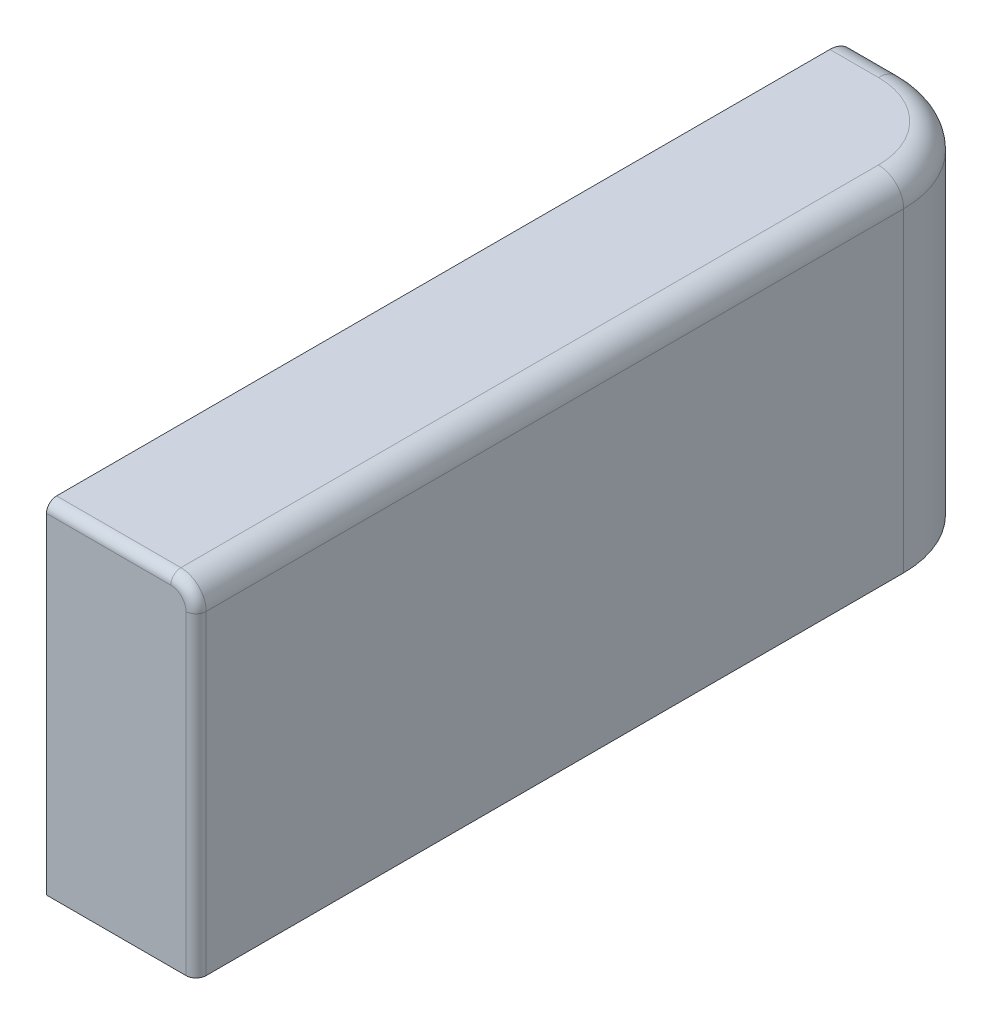
ISO-10303-21;
HEADER;
FILE_DESCRIPTION(('STEP AP214'),'2;1');
FILE_NAME('part.step','',(''),(''),'','','');
FILE_SCHEMA(('AUTOMOTIVE_DESIGN { 1 0 10303 214 1 1 1 1 }'));
ENDSEC;
DATA;
#1=APPLICATION_CONTEXT('core data for automotive mechanical design processes');
#2=APPLICATION_PROTOCOL_DEFINITION('international standard','automotive_design',2000,#1);
#3=PRODUCT_CONTEXT('',#1,'mechanical');
#4=PRODUCT('Part','Part','',(#3));
#5=PRODUCT_RELATED_PRODUCT_CATEGORY('part','',(#4));
#6=PRODUCT_DEFINITION_FORMATION('','',#4);
#7=PRODUCT_DEFINITION_CONTEXT('part definition',#1,'design');
#8=PRODUCT_DEFINITION('design','',#6,#7);
#9=PRODUCT_DEFINITION_SHAPE('','',#8);
#10=(LENGTH_UNIT() NAMED_UNIT(*) SI_UNIT(.MILLI.,.METRE.));
#11=(NAMED_UNIT(*) PLANE_ANGLE_UNIT() SI_UNIT($,.RADIAN.));
#12=(NAMED_UNIT(*) SI_UNIT($,.STERADIAN.) SOLID_ANGLE_UNIT());
#13=UNCERTAINTY_MEASURE_WITH_UNIT(LENGTH_MEASURE(1.E-05),#10,'distance_accuracy_value','');
#14=(GEOMETRIC_REPRESENTATION_CONTEXT(3) GLOBAL_UNCERTAINTY_ASSIGNED_CONTEXT((#13)) GLOBAL_UNIT_ASSIGNED_CONTEXT((#10,
#11,#12)) REPRESENTATION_CONTEXT('',''));
#15=CARTESIAN_POINT('',(0.,0.,0.));
#16=DIRECTION('',(0.,0.,1.));
#17=DIRECTION('',(1.,0.,0.));
#18=AXIS2_PLACEMENT_3D('',#15,#16,#17);
#19=CARTESIAN_POINT('',(148.,337.,0.));
#20=DIRECTION('',(0.,0.,-1.));
#21=DIRECTION('',(-1.,0.,0.));
#22=AXIS2_PLACEMENT_3D('',#19,#20,#21);
#23=PLANE('',#22);
#24=DIRECTION('',(1.,0.,0.));
#25=VECTOR('',#24,1.);
#26=CARTESIAN_POINT('',(148.,0.,0.));
#27=LINE('',#26,#25);
#28=CARTESIAN_POINT('',(0.,0.,0.));
#29=VERTEX_POINT('',#28);
#30=CARTESIAN_POINT('',(138.,0.,0.));
#31=VERTEX_POINT('',#30);
#32=EDGE_CURVE('E121',#29,#31,#27,.T.);
#33=ORIENTED_EDGE('',*,*,#32,.T.);
#34=DIRECTION('',(0.,-1.,0.));
#35=VECTOR('',#34,1.);
#36=CARTESIAN_POINT('',(138.,337.,0.));
#37=LINE('',#36,#35);
#38=CARTESIAN_POINT('',(138.,312.,0.));
#39=VERTEX_POINT('',#38);
#40=EDGE_CURVE('E175',#31,#39,#37,.F.);
#41=ORIENTED_EDGE('',*,*,#40,.T.);
#42=CARTESIAN_POINT('',(123.,312.,0.));
#43=DIRECTION('',(0.,0.,-1.));
#44=DIRECTION('',(-1.,0.,0.));
#45=AXIS2_PLACEMENT_3D('',#42,#43,#44);
#46=CIRCLE('',#45,15.);
#47=CARTESIAN_POINT('',(123.,327.,0.));
#48=VERTEX_POINT('',#47);
#49=EDGE_CURVE('E173',#39,#48,#46,.F.);
#50=ORIENTED_EDGE('',*,*,#49,.T.);
#51=DIRECTION('',(1.,0.,0.));
#52=VECTOR('',#51,1.);
#53=CARTESIAN_POINT('',(0.,327.,0.));
#54=LINE('',#53,#52);
#55=CARTESIAN_POINT('',(0.,327.,0.));
#56=VERTEX_POINT('',#55);
#57=EDGE_CURVE('E171',#48,#56,#54,.F.);
#58=ORIENTED_EDGE('',*,*,#57,.T.);
#59=DIRECTION('',(0.,-1.,0.));
#60=VECTOR('',#59,1.);
#61=CARTESIAN_POINT('',(0.,337.,0.));
#62=LINE('',#61,#60);
#63=EDGE_CURVE('E145',#56,#29,#62,.T.);
#64=ORIENTED_EDGE('',*,*,#63,.T.);
#65=EDGE_LOOP('',(#33,#41,#50,#58,#64));
#66=FACE_BOUND('',#65,.T.);
#67=ADVANCED_FACE('F37',(#66),#23,.F.);
#68=CARTESIAN_POINT('',(148.,337.,-699.999999999999));
#69=DIRECTION('',(-1.,0.,0.));
#70=DIRECTION('',(0.,0.,1.));
#71=AXIS2_PLACEMENT_3D('',#68,#69,#70);
#72=PLANE('',#71);
#73=DIRECTION('',(0.,0.,-1.));
#74=VECTOR('',#73,1.);
#75=CARTESIAN_POINT('',(148.,312.,-1.11022302462516E-13));
#76=LINE('',#75,#74);
#77=CARTESIAN_POINT('',(148.,312.,-699.999999999999));
#78=VERTEX_POINT('',#77);
#79=CARTESIAN_POINT('',(148.,312.,-10.));
#80=VERTEX_POINT('',#79);
#81=EDGE_CURVE('E155',#78,#80,#76,.F.);
#82=ORIENTED_EDGE('',*,*,#81,.T.);
#83=DIRECTION('',(0.,-1.,0.));
#84=VECTOR('',#83,1.);
#85=CARTESIAN_POINT('',(148.,337.,-10.0000000000001));
#86=LINE('',#85,#84);
#87=CARTESIAN_POINT('',(148.,0.,-10.0000000000003));
#88=VERTEX_POINT('',#87);
#89=EDGE_CURVE('E117',#80,#88,#86,.T.);
#90=ORIENTED_EDGE('',*,*,#89,.T.);
#91=DIRECTION('',(0.,0.,-1.));
#92=VECTOR('',#91,1.);
#93=CARTESIAN_POINT('',(148.,0.,-699.999999999999));
#94=LINE('',#93,#92);
#95=CARTESIAN_POINT('',(148.,0.,-699.999999999999));
#96=VERTEX_POINT('',#95);
#97=EDGE_CURVE('E110',#88,#96,#94,.T.);
#98=ORIENTED_EDGE('',*,*,#97,.T.);
#99=DIRECTION('',(0.,-1.,0.));
#100=VECTOR('',#99,1.);
#101=CARTESIAN_POINT('',(148.,337.,-699.999999999999));
#102=LINE('',#101,#100);
#103=EDGE_CURVE('E114',#78,#96,#102,.T.);
#104=ORIENTED_EDGE('',*,*,#103,.F.);
#105=EDGE_LOOP('',(#82,#90,#98,#104));
#106=FACE_BOUND('',#105,.T.);
#107=ADVANCED_FACE('F113',(#106),#72,.F.);
#108=CARTESIAN_POINT('',(47.9999999999999,337.,-700.));
#109=DIRECTION('',(0.,-1.,0.));
#110=DIRECTION('',(0.,0.,-1.));
#111=AXIS2_PLACEMENT_3D('',#108,#109,#110);
#112=CYLINDRICAL_SURFACE('',#111,100.);
#113=DIRECTION('',(0.,-1.,0.));
#114=VECTOR('',#113,1.);
#115=CARTESIAN_POINT('',(47.9999999999991,337.,-800.));
#116=LINE('',#115,#114);
#117=CARTESIAN_POINT('',(47.9999999999991,312.,-800.));
#118=VERTEX_POINT('',#117);
#119=CARTESIAN_POINT('',(47.9999999999991,0.,-800.));
#120=VERTEX_POINT('',#119);
#121=EDGE_CURVE('E131',#118,#120,#116,.T.);
#122=ORIENTED_EDGE('',*,*,#121,.F.);
#123=CARTESIAN_POINT('',(47.9999999999999,312.,-700.));
#124=DIRECTION('',(0.,1.,0.));
#125=DIRECTION('',(0.,0.,1.));
#126=AXIS2_PLACEMENT_3D('',#123,#124,#125);
#127=CIRCLE('',#126,100.);
#128=EDGE_CURVE('E129',#118,#78,#127,.F.);
#129=ORIENTED_EDGE('',*,*,#128,.T.);
#130=ORIENTED_EDGE('',*,*,#103,.T.);
#131=CARTESIAN_POINT('',(47.9999999999999,0.,-700.));
#132=DIRECTION('',(0.,1.,0.));
#133=DIRECTION('',(0.,0.,1.));
#134=AXIS2_PLACEMENT_3D('',#131,#132,#133);
#135=CIRCLE('',#134,100.);
#136=EDGE_CURVE('E120',#96,#120,#135,.T.);
#137=ORIENTED_EDGE('',*,*,#136,.T.);
#138=EDGE_LOOP('',(#122,#129,#130,#137));
#139=FACE_BOUND('',#138,.T.);
#140=ADVANCED_FACE('F126',(#139),#112,.T.);
#141=CARTESIAN_POINT('',(0.,337.,-800.));
#142=DIRECTION('',(0.,0.,1.));
#143=DIRECTION('',(1.,0.,0.));
#144=AXIS2_PLACEMENT_3D('',#141,#142,#143);
#145=PLANE('',#144);
#146=DIRECTION('',(0.,-1.,0.));
#147=VECTOR('',#146,1.);
#148=CARTESIAN_POINT('',(0.,337.,-800.));
#149=LINE('',#148,#147);
#150=CARTESIAN_POINT('',(0.,312.,-800.));
#151=VERTEX_POINT('',#150);
#152=CARTESIAN_POINT('',(0.,0.,-800.));
#153=VERTEX_POINT('',#152);
#154=EDGE_CURVE('E147',#151,#153,#149,.T.);
#155=ORIENTED_EDGE('',*,*,#154,.F.);
#156=DIRECTION('',(-1.,0.,0.));
#157=VECTOR('',#156,1.);
#158=CARTESIAN_POINT('',(47.9999999999991,312.,-800.));
#159=LINE('',#158,#157);
#160=EDGE_CURVE('E159',#151,#118,#159,.F.);
#161=ORIENTED_EDGE('',*,*,#160,.T.);
#162=ORIENTED_EDGE('',*,*,#121,.T.);
#163=DIRECTION('',(-1.,0.,0.));
#164=VECTOR('',#163,1.);
#165=CARTESIAN_POINT('',(0.,0.,-800.));
#166=LINE('',#165,#164);
#167=EDGE_CURVE('E136',#120,#153,#166,.T.);
#168=ORIENTED_EDGE('',*,*,#167,.T.);
#169=EDGE_LOOP('',(#155,#161,#162,#168));
#170=FACE_BOUND('',#169,.T.);
#171=ADVANCED_FACE('F206',(#170),#145,.F.);
#172=CARTESIAN_POINT('',(0.,337.,0.));
#173=DIRECTION('',(1.,0.,0.));
#174=DIRECTION('',(0.,0.,-1.));
#175=AXIS2_PLACEMENT_3D('',#172,#173,#174);
#176=PLANE('',#175);
#177=ORIENTED_EDGE('',*,*,#63,.F.);
#178=CARTESIAN_POINT('',(0.,327.,-9.99999999999999));
#179=DIRECTION('',(1.,0.,0.));
#180=DIRECTION('',(0.,0.,-1.));
#181=AXIS2_PLACEMENT_3D('',#178,#179,#180);
#182=CIRCLE('',#181,10.);
#183=CARTESIAN_POINT('',(0.,337.,-9.99999999999999));
#184=VERTEX_POINT('',#183);
#185=EDGE_CURVE('E11',#56,#184,#182,.F.);
#186=ORIENTED_EDGE('',*,*,#185,.T.);
#187=DIRECTION('',(0.,0.,1.));
#188=VECTOR('',#187,1.);
#189=CARTESIAN_POINT('',(0.,337.,0.));
#190=LINE('',#189,#188);
#191=CARTESIAN_POINT('',(0.,337.,-775.));
#192=VERTEX_POINT('',#191);
#193=EDGE_CURVE('E144',#192,#184,#190,.T.);
#194=ORIENTED_EDGE('',*,*,#193,.F.);
#195=CARTESIAN_POINT('',(0.,312.,-775.));
#196=DIRECTION('',(1.,0.,0.));
#197=DIRECTION('',(0.,0.,-1.));
#198=AXIS2_PLACEMENT_3D('',#195,#196,#197);
#199=CIRCLE('',#198,25.);
#200=EDGE_CURVE('E157',#192,#151,#199,.F.);
#201=ORIENTED_EDGE('',*,*,#200,.T.);
#202=ORIENTED_EDGE('',*,*,#154,.T.);
#203=DIRECTION('',(0.,0.,1.));
#204=VECTOR('',#203,1.);
#205=CARTESIAN_POINT('',(0.,0.,0.));
#206=LINE('',#205,#204);
#207=EDGE_CURVE('E138',#153,#29,#206,.T.);
#208=ORIENTED_EDGE('',*,*,#207,.T.);
#209=EDGE_LOOP('',(#177,#186,#194,#201,#202,#208));
#210=FACE_BOUND('',#209,.T.);
#211=ADVANCED_FACE('F194',(#210),#176,.F.);
#212=CARTESIAN_POINT('',(47.9999999999999,337.,-700.));
#213=DIRECTION('',(0.,1.,0.));
#214=DIRECTION('',(0.,0.,1.));
#215=AXIS2_PLACEMENT_3D('',#212,#213,#214);
#216=PLANE('',#215);
#217=ORIENTED_EDGE('',*,*,#193,.T.);
#218=DIRECTION('',(1.,0.,0.));
#219=VECTOR('',#218,1.);
#220=CARTESIAN_POINT('',(123.,337.,-10.));
#221=LINE('',#220,#219);
#222=CARTESIAN_POINT('',(123.,337.,-10.));
#223=VERTEX_POINT('',#222);
#224=EDGE_CURVE('E46',#184,#223,#221,.T.);
#225=ORIENTED_EDGE('',*,*,#224,.T.);
#226=DIRECTION('',(0.,0.,-1.));
#227=VECTOR('',#226,1.);
#228=CARTESIAN_POINT('',(123.,337.,-699.999999999999));
#229=LINE('',#228,#227);
#230=CARTESIAN_POINT('',(123.,337.,-699.999999999999));
#231=VERTEX_POINT('',#230);
#232=EDGE_CURVE('E153',#223,#231,#229,.T.);
#233=ORIENTED_EDGE('',*,*,#232,.T.);
#234=CARTESIAN_POINT('',(47.9999999999999,337.,-700.));
#235=DIRECTION('',(0.,1.,0.));
#236=DIRECTION('',(0.,0.,1.));
#237=AXIS2_PLACEMENT_3D('',#234,#235,#236);
#238=CIRCLE('',#237,75.);
#239=CARTESIAN_POINT('',(47.9999999999991,337.,-775.));
#240=VERTEX_POINT('',#239);
#241=EDGE_CURVE('E130',#231,#240,#238,.T.);
#242=ORIENTED_EDGE('',*,*,#241,.T.);
#243=DIRECTION('',(-1.,0.,0.));
#244=VECTOR('',#243,1.);
#245=CARTESIAN_POINT('',(0.,337.,-775.));
#246=LINE('',#245,#244);
#247=EDGE_CURVE('E151',#240,#192,#246,.T.);
#248=ORIENTED_EDGE('',*,*,#247,.T.);
#249=EDGE_LOOP('',(#217,#225,#233,#242,#248));
#250=FACE_BOUND('',#249,.T.);
#251=ADVANCED_FACE('F198',(#250),#216,.T.);
#252=CARTESIAN_POINT('',(47.9999999999999,0.,-700.));
#253=DIRECTION('',(0.,1.,0.));
#254=DIRECTION('',(0.,0.,1.));
#255=AXIS2_PLACEMENT_3D('',#252,#253,#254);
#256=PLANE('',#255);
#257=ORIENTED_EDGE('',*,*,#97,.F.);
#258=CARTESIAN_POINT('',(138.,0.,-10.0000000000001));
#259=DIRECTION('',(0.,1.,0.));
#260=DIRECTION('',(0.,0.,1.));
#261=AXIS2_PLACEMENT_3D('',#258,#259,#260);
#262=CIRCLE('',#261,10.);
#263=EDGE_CURVE('E169',#88,#31,#262,.F.);
#264=ORIENTED_EDGE('',*,*,#263,.T.);
#265=ORIENTED_EDGE('',*,*,#32,.F.);
#266=ORIENTED_EDGE('',*,*,#207,.F.);
#267=ORIENTED_EDGE('',*,*,#167,.F.);
#268=ORIENTED_EDGE('',*,*,#136,.F.);
#269=EDGE_LOOP('',(#257,#264,#265,#266,#267,#268));
#270=FACE_BOUND('',#269,.T.);
#271=ADVANCED_FACE('F133',(#270),#256,.F.);
#272=CARTESIAN_POINT('',(47.9999999999999,312.,-775.));
#273=DIRECTION('',(1.,0.,0.));
#274=DIRECTION('',(0.,0.,-1.));
#275=AXIS2_PLACEMENT_3D('',#272,#273,#274);
#276=CYLINDRICAL_SURFACE('',#275,25.);
#277=ORIENTED_EDGE('',*,*,#200,.F.);
#278=ORIENTED_EDGE('',*,*,#247,.F.);
#279=CARTESIAN_POINT('',(47.9999999999991,312.,-775.));
#280=DIRECTION('',(1.,0.,0.));
#281=DIRECTION('',(0.,0.,-1.));
#282=AXIS2_PLACEMENT_3D('',#279,#280,#281);
#283=CIRCLE('',#282,25.);
#284=EDGE_CURVE('E165',#118,#240,#283,.T.);
#285=ORIENTED_EDGE('',*,*,#284,.F.);
#286=ORIENTED_EDGE('',*,*,#160,.F.);
#287=EDGE_LOOP('',(#277,#278,#285,#286));
#288=FACE_BOUND('',#287,.T.);
#289=ADVANCED_FACE('F203',(#288),#276,.T.);
#290=CARTESIAN_POINT('',(47.9999999999999,312.,-700.));
#291=DIRECTION('',(0.,1.,0.));
#292=DIRECTION('',(0.,0.,1.));
#293=AXIS2_PLACEMENT_3D('',#290,#291,#292);
#294=TOROIDAL_SURFACE('',#293,75.,25.);
#295=ORIENTED_EDGE('',*,*,#284,.T.);
#296=ORIENTED_EDGE('',*,*,#241,.F.);
#297=CARTESIAN_POINT('',(123.,312.,-700.));
#298=DIRECTION('',(0.,0.,1.));
#299=DIRECTION('',(1.,0.,0.));
#300=AXIS2_PLACEMENT_3D('',#297,#298,#299);
#301=CIRCLE('',#300,25.);
#302=EDGE_CURVE('E162',#78,#231,#301,.T.);
#303=ORIENTED_EDGE('',*,*,#302,.F.);
#304=ORIENTED_EDGE('',*,*,#128,.F.);
#305=EDGE_LOOP('',(#295,#296,#303,#304));
#306=FACE_BOUND('',#305,.T.);
#307=ADVANCED_FACE('F225',(#306),#294,.T.);
#308=CARTESIAN_POINT('',(123.,312.,-700.));
#309=DIRECTION('',(0.,0.,1.));
#310=DIRECTION('',(1.,0.,0.));
#311=AXIS2_PLACEMENT_3D('',#308,#309,#310);
#312=CYLINDRICAL_SURFACE('',#311,25.);
#313=ORIENTED_EDGE('',*,*,#232,.F.);
#314=CARTESIAN_POINT('',(123.,312.,-10.));
#315=DIRECTION('',(0.,0.,-1.));
#316=DIRECTION('',(-1.,0.,0.));
#317=AXIS2_PLACEMENT_3D('',#314,#315,#316);
#318=CIRCLE('',#317,25.);
#319=EDGE_CURVE('E177',#223,#80,#318,.T.);
#320=ORIENTED_EDGE('',*,*,#319,.T.);
#321=ORIENTED_EDGE('',*,*,#81,.F.);
#322=ORIENTED_EDGE('',*,*,#302,.T.);
#323=EDGE_LOOP('',(#313,#320,#321,#322));
#324=FACE_BOUND('',#323,.T.);
#325=ADVANCED_FACE('F222',(#324),#312,.T.);
#326=CARTESIAN_POINT('',(48.0000000000001,327.,-10.));
#327=DIRECTION('',(-1.,0.,0.));
#328=DIRECTION('',(0.,0.,1.));
#329=AXIS2_PLACEMENT_3D('',#326,#327,#328);
#330=CYLINDRICAL_SURFACE('',#329,10.);
#331=ORIENTED_EDGE('',*,*,#185,.F.);
#332=ORIENTED_EDGE('',*,*,#57,.F.);
#333=CARTESIAN_POINT('',(123.,327.,-10.));
#334=DIRECTION('',(1.,0.,0.));
#335=DIRECTION('',(0.,0.,-1.));
#336=AXIS2_PLACEMENT_3D('',#333,#334,#335);
#337=CIRCLE('',#336,10.);
#338=EDGE_CURVE('E41',#223,#48,#337,.T.);
#339=ORIENTED_EDGE('',*,*,#338,.F.);
#340=ORIENTED_EDGE('',*,*,#224,.F.);
#341=EDGE_LOOP('',(#331,#332,#339,#340));
#342=FACE_BOUND('',#341,.T.);
#343=ADVANCED_FACE('F39',(#342),#330,.T.);
#344=CARTESIAN_POINT('',(123.,312.,-10.));
#345=DIRECTION('',(0.,0.,-1.));
#346=DIRECTION('',(-1.,0.,0.));
#347=AXIS2_PLACEMENT_3D('',#344,#345,#346);
#348=TOROIDAL_SURFACE('',#347,15.,10.);
#349=ORIENTED_EDGE('',*,*,#338,.T.);
#350=ORIENTED_EDGE('',*,*,#49,.F.);
#351=CARTESIAN_POINT('',(138.,312.,-10.));
#352=DIRECTION('',(0.,-1.,0.));
#353=DIRECTION('',(0.,0.,-1.));
#354=AXIS2_PLACEMENT_3D('',#351,#352,#353);
#355=CIRCLE('',#354,10.);
#356=EDGE_CURVE('E179',#80,#39,#355,.T.);
#357=ORIENTED_EDGE('',*,*,#356,.F.);
#358=ORIENTED_EDGE('',*,*,#319,.F.);
#359=EDGE_LOOP('',(#349,#350,#357,#358));
#360=FACE_BOUND('',#359,.T.);
#361=ADVANCED_FACE('F189',(#360),#348,.T.);
#362=CARTESIAN_POINT('',(138.,337.,-10.0000000000001));
#363=DIRECTION('',(0.,-1.,0.));
#364=DIRECTION('',(0.,0.,-1.));
#365=AXIS2_PLACEMENT_3D('',#362,#363,#364);
#366=CYLINDRICAL_SURFACE('',#365,10.);
#367=ORIENTED_EDGE('',*,*,#356,.T.);
#368=ORIENTED_EDGE('',*,*,#40,.F.);
#369=ORIENTED_EDGE('',*,*,#263,.F.);
#370=ORIENTED_EDGE('',*,*,#89,.F.);
#371=EDGE_LOOP('',(#367,#368,#369,#370));
#372=FACE_BOUND('',#371,.T.);
#373=ADVANCED_FACE('F232',(#372),#366,.T.);
#374=CLOSED_SHELL('',(#67,#107,#140,#171,#211,#251,#271,#289,#307,#325,#343,#361,#373));
#375=MANIFOLD_SOLID_BREP('B2',#374);
#376=ADVANCED_BREP_SHAPE_REPRESENTATION('',(#18,#375),#14);
#377=SHAPE_DEFINITION_REPRESENTATION(#9,#376);
ENDSEC;
END-ISO-10303-21;
